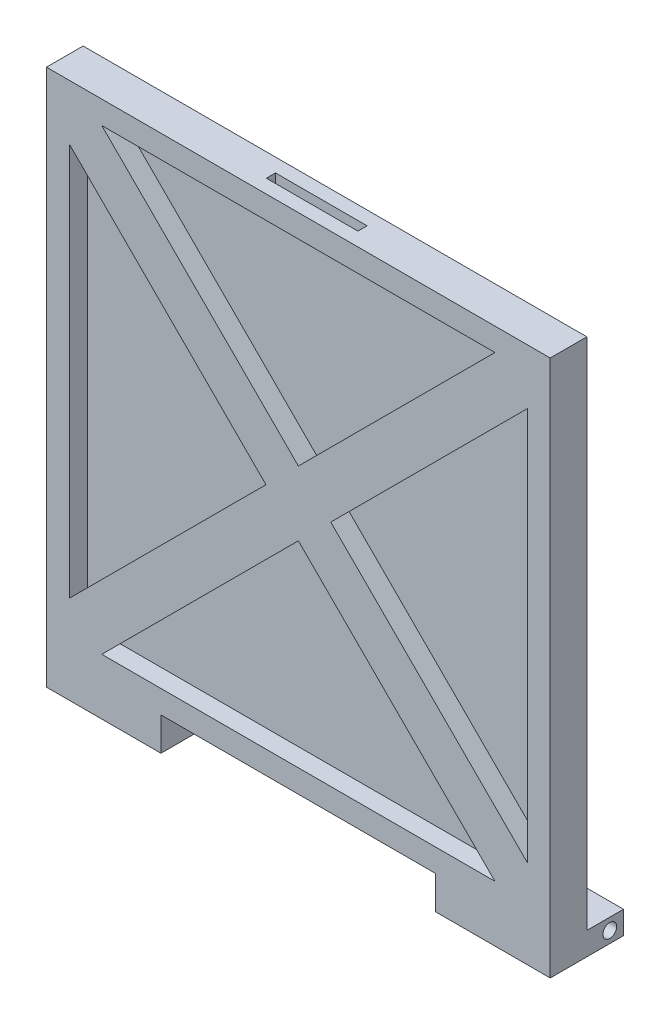
ISO-10303-21;
HEADER;
FILE_DESCRIPTION(('STEP AP214'),'2;1');
FILE_NAME('part.step','',(''),(''),'','','');
FILE_SCHEMA(('AUTOMOTIVE_DESIGN { 1 0 10303 214 1 1 1 1 }'));
ENDSEC;
DATA;
#1=APPLICATION_CONTEXT('core data for automotive mechanical design processes');
#2=APPLICATION_PROTOCOL_DEFINITION('international standard','automotive_design',2000,#1);
#3=PRODUCT_CONTEXT('',#1,'mechanical');
#4=PRODUCT('Part','Part','',(#3));
#5=PRODUCT_RELATED_PRODUCT_CATEGORY('part','',(#4));
#6=PRODUCT_DEFINITION_FORMATION('','',#4);
#7=PRODUCT_DEFINITION_CONTEXT('part definition',#1,'design');
#8=PRODUCT_DEFINITION('design','',#6,#7);
#9=PRODUCT_DEFINITION_SHAPE('','',#8);
#10=(LENGTH_UNIT() NAMED_UNIT(*) SI_UNIT(.MILLI.,.METRE.));
#11=(NAMED_UNIT(*) PLANE_ANGLE_UNIT() SI_UNIT($,.RADIAN.));
#12=(NAMED_UNIT(*) SI_UNIT($,.STERADIAN.) SOLID_ANGLE_UNIT());
#13=UNCERTAINTY_MEASURE_WITH_UNIT(LENGTH_MEASURE(1.E-05),#10,'distance_accuracy_value','');
#14=(GEOMETRIC_REPRESENTATION_CONTEXT(3) GLOBAL_UNCERTAINTY_ASSIGNED_CONTEXT((#13)) GLOBAL_UNIT_ASSIGNED_CONTEXT((#10,
#11,#12)) REPRESENTATION_CONTEXT('',''));
#15=CARTESIAN_POINT('',(0.,0.,0.));
#16=DIRECTION('',(0.,0.,1.));
#17=DIRECTION('',(1.,0.,0.));
#18=AXIS2_PLACEMENT_3D('',#15,#16,#17);
#19=CARTESIAN_POINT('',(55.,-55.,8.));
#20=DIRECTION('',(0.,1.,0.));
#21=DIRECTION('',(-1.,0.,0.));
#22=AXIS2_PLACEMENT_3D('',#19,#20,#21);
#23=PLANE('',#22);
#24=DIRECTION('',(0.,0.,1.));
#25=VECTOR('',#24,1.);
#26=CARTESIAN_POINT('',(-30.,-55.,0.));
#27=LINE('',#26,#25);
#28=CARTESIAN_POINT('',(-30.,-55.,0.));
#29=VERTEX_POINT('',#28);
#30=CARTESIAN_POINT('',(-30.,-55.,8.));
#31=VERTEX_POINT('',#30);
#32=EDGE_CURVE('E366',#29,#31,#27,.T.);
#33=ORIENTED_EDGE('',*,*,#32,.F.);
#34=DIRECTION('',(1.,0.,0.));
#35=VECTOR('',#34,1.);
#36=CARTESIAN_POINT('',(55.,-55.,0.));
#37=LINE('',#36,#35);
#38=CARTESIAN_POINT('',(30.,-55.,0.));
#39=VERTEX_POINT('',#38);
#40=EDGE_CURVE('E446',#29,#39,#37,.T.);
#41=ORIENTED_EDGE('',*,*,#40,.T.);
#42=DIRECTION('',(0.,0.,1.));
#43=VECTOR('',#42,1.);
#44=CARTESIAN_POINT('',(30.,-55.,0.));
#45=LINE('',#44,#43);
#46=CARTESIAN_POINT('',(30.,-55.,8.));
#47=VERTEX_POINT('',#46);
#48=EDGE_CURVE('E399',#39,#47,#45,.T.);
#49=ORIENTED_EDGE('',*,*,#48,.T.);
#50=DIRECTION('',(1.,0.,0.));
#51=VECTOR('',#50,1.);
#52=CARTESIAN_POINT('',(55.,-55.,8.));
#53=LINE('',#52,#51);
#54=EDGE_CURVE('E438',#31,#47,#53,.T.);
#55=ORIENTED_EDGE('',*,*,#54,.F.);
#56=EDGE_LOOP('',(#33,#41,#49,#55));
#57=FACE_BOUND('',#56,.T.);
#58=ADVANCED_FACE('F38',(#57),#23,.F.);
#59=CARTESIAN_POINT('',(-55.,-55.,8.));
#60=DIRECTION('',(1.,0.,0.));
#61=DIRECTION('',(0.,0.,-1.));
#62=AXIS2_PLACEMENT_3D('',#59,#60,#61);
#63=PLANE('',#62);
#64=CARTESIAN_POINT('',(-55.,-59.7629076678404,-5.));
#65=DIRECTION('',(1.,0.,0.));
#66=DIRECTION('',(0.,0.,-1.));
#67=AXIS2_PLACEMENT_3D('',#64,#65,#66);
#68=CIRCLE('',#67,1.5);
#69=CARTESIAN_POINT('',(-55.,-59.7629076678404,-6.5));
#70=VERTEX_POINT('',#69);
#71=EDGE_CURVE('E362',#70,#70,#68,.T.);
#72=ORIENTED_EDGE('',*,*,#71,.T.);
#73=EDGE_LOOP('',(#72));
#74=FACE_BOUND('',#73,.T.);
#75=DIRECTION('',(0.,-1.,0.));
#76=VECTOR('',#75,1.);
#77=CARTESIAN_POINT('',(-55.,-55.,0.));
#78=LINE('',#77,#76);
#79=CARTESIAN_POINT('',(-55.,55.,0.));
#80=VERTEX_POINT('',#79);
#81=CARTESIAN_POINT('',(-55.,-57.25,0.));
#82=VERTEX_POINT('',#81);
#83=EDGE_CURVE('E429',#80,#82,#78,.T.);
#84=ORIENTED_EDGE('',*,*,#83,.T.);
#85=DIRECTION('',(0.,0.,1.));
#86=VECTOR('',#85,1.);
#87=CARTESIAN_POINT('',(-55.,-57.25,-8.));
#88=LINE('',#87,#86);
#89=CARTESIAN_POINT('',(-55.,-57.25,-8.));
#90=VERTEX_POINT('',#89);
#91=EDGE_CURVE('E365',#90,#82,#88,.T.);
#92=ORIENTED_EDGE('',*,*,#91,.F.);
#93=DIRECTION('',(0.,1.,0.));
#94=VECTOR('',#93,1.);
#95=CARTESIAN_POINT('',(-55.,-62.25,-8.));
#96=LINE('',#95,#94);
#97=CARTESIAN_POINT('',(-55.,-62.25,-8.));
#98=VERTEX_POINT('',#97);
#99=EDGE_CURVE('E384',#98,#90,#96,.T.);
#100=ORIENTED_EDGE('',*,*,#99,.F.);
#101=DIRECTION('',(0.,0.,-1.));
#102=VECTOR('',#101,1.);
#103=CARTESIAN_POINT('',(-55.,-62.25,8.));
#104=LINE('',#103,#102);
#105=CARTESIAN_POINT('',(-55.,-62.25,8.));
#106=VERTEX_POINT('',#105);
#107=EDGE_CURVE('E370',#106,#98,#104,.T.);
#108=ORIENTED_EDGE('',*,*,#107,.F.);
#109=DIRECTION('',(0.,-1.,0.));
#110=VECTOR('',#109,1.);
#111=CARTESIAN_POINT('',(-55.,-55.,8.));
#112=LINE('',#111,#110);
#113=CARTESIAN_POINT('',(-55.,55.,8.));
#114=VERTEX_POINT('',#113);
#115=EDGE_CURVE('E436',#114,#106,#112,.T.);
#116=ORIENTED_EDGE('',*,*,#115,.F.);
#117=DIRECTION('',(0.,0.,-1.));
#118=VECTOR('',#117,1.);
#119=CARTESIAN_POINT('',(-55.,55.,8.));
#120=LINE('',#119,#118);
#121=EDGE_CURVE('E47',#114,#80,#120,.T.);
#122=ORIENTED_EDGE('',*,*,#121,.T.);
#123=EDGE_LOOP('',(#84,#92,#100,#108,#116,#122));
#124=FACE_BOUND('',#123,.T.);
#125=ADVANCED_FACE('F40',(#74,#124),#63,.F.);
#126=CARTESIAN_POINT('',(55.,-55.,8.));
#127=DIRECTION('',(-1.,0.,0.));
#128=DIRECTION('',(0.,0.,1.));
#129=AXIS2_PLACEMENT_3D('',#126,#127,#128);
#130=PLANE('',#129);
#131=CARTESIAN_POINT('',(55.,-59.7629076678404,-5.));
#132=DIRECTION('',(-1.,0.,0.));
#133=DIRECTION('',(0.,0.,1.));
#134=AXIS2_PLACEMENT_3D('',#131,#132,#133);
#135=CIRCLE('',#134,1.5);
#136=CARTESIAN_POINT('',(55.,-59.7629076678404,-3.5));
#137=VERTEX_POINT('',#136);
#138=EDGE_CURVE('E352',#137,#137,#135,.T.);
#139=ORIENTED_EDGE('',*,*,#138,.T.);
#140=EDGE_LOOP('',(#139));
#141=FACE_BOUND('',#140,.T.);
#142=DIRECTION('',(0.,1.,0.));
#143=VECTOR('',#142,1.);
#144=CARTESIAN_POINT('',(55.,-55.,0.));
#145=LINE('',#144,#143);
#146=CARTESIAN_POINT('',(55.,-57.25,0.));
#147=VERTEX_POINT('',#146);
#148=CARTESIAN_POINT('',(55.,55.,0.));
#149=VERTEX_POINT('',#148);
#150=EDGE_CURVE('E448',#147,#149,#145,.T.);
#151=ORIENTED_EDGE('',*,*,#150,.T.);
#152=DIRECTION('',(0.,0.,-1.));
#153=VECTOR('',#152,1.);
#154=CARTESIAN_POINT('',(55.,55.,8.));
#155=LINE('',#154,#153);
#156=CARTESIAN_POINT('',(55.,55.,8.));
#157=VERTEX_POINT('',#156);
#158=EDGE_CURVE('E11',#157,#149,#155,.T.);
#159=ORIENTED_EDGE('',*,*,#158,.F.);
#160=DIRECTION('',(0.,1.,0.));
#161=VECTOR('',#160,1.);
#162=CARTESIAN_POINT('',(55.,-55.,8.));
#163=LINE('',#162,#161);
#164=CARTESIAN_POINT('',(55.,-62.25,8.));
#165=VERTEX_POINT('',#164);
#166=EDGE_CURVE('E441',#165,#157,#163,.T.);
#167=ORIENTED_EDGE('',*,*,#166,.F.);
#168=DIRECTION('',(0.,0.,-1.));
#169=VECTOR('',#168,1.);
#170=CARTESIAN_POINT('',(55.,-62.25,8.));
#171=LINE('',#170,#169);
#172=CARTESIAN_POINT('',(55.,-62.25,-8.));
#173=VERTEX_POINT('',#172);
#174=EDGE_CURVE('E390',#165,#173,#171,.T.);
#175=ORIENTED_EDGE('',*,*,#174,.T.);
#176=DIRECTION('',(0.,1.,0.));
#177=VECTOR('',#176,1.);
#178=CARTESIAN_POINT('',(55.,-62.25,-8.));
#179=LINE('',#178,#177);
#180=CARTESIAN_POINT('',(55.,-57.25,-8.));
#181=VERTEX_POINT('',#180);
#182=EDGE_CURVE('E421',#173,#181,#179,.T.);
#183=ORIENTED_EDGE('',*,*,#182,.T.);
#184=DIRECTION('',(0.,0.,1.));
#185=VECTOR('',#184,1.);
#186=CARTESIAN_POINT('',(55.,-57.25,-8.));
#187=LINE('',#186,#185);
#188=EDGE_CURVE('E403',#181,#147,#187,.T.);
#189=ORIENTED_EDGE('',*,*,#188,.T.);
#190=EDGE_LOOP('',(#151,#159,#167,#175,#183,#189));
#191=FACE_BOUND('',#190,.T.);
#192=ADVANCED_FACE('F484',(#141,#191),#130,.F.);
#193=CARTESIAN_POINT('',(55.,55.,8.));
#194=DIRECTION('',(0.,-1.,0.));
#195=DIRECTION('',(1.,0.,0.));
#196=AXIS2_PLACEMENT_3D('',#193,#194,#195);
#197=PLANE('',#196);
#198=DIRECTION('',(1.,0.,0.));
#199=VECTOR('',#198,1.);
#200=CARTESIAN_POINT('',(-10.,55.,4.99999999999999));
#201=LINE('',#200,#199);
#202=CARTESIAN_POINT('',(-10.,55.,4.99999999999999));
#203=VERTEX_POINT('',#202);
#204=CARTESIAN_POINT('',(9.99999999999999,55.,4.99999999999999));
#205=VERTEX_POINT('',#204);
#206=EDGE_CURVE('E253',#203,#205,#201,.T.);
#207=ORIENTED_EDGE('',*,*,#206,.F.);
#208=DIRECTION('',(0.,0.,1.));
#209=VECTOR('',#208,1.);
#210=CARTESIAN_POINT('',(-10.,55.,2.99999999999999));
#211=LINE('',#210,#209);
#212=CARTESIAN_POINT('',(-10.,55.,2.99999999999999));
#213=VERTEX_POINT('',#212);
#214=EDGE_CURVE('E54',#213,#203,#211,.T.);
#215=ORIENTED_EDGE('',*,*,#214,.F.);
#216=DIRECTION('',(-1.,0.,0.));
#217=VECTOR('',#216,1.);
#218=CARTESIAN_POINT('',(-10.,55.,2.99999999999999));
#219=LINE('',#218,#217);
#220=CARTESIAN_POINT('',(9.99999999999999,55.,2.99999999999999));
#221=VERTEX_POINT('',#220);
#222=EDGE_CURVE('E244',#221,#213,#219,.T.);
#223=ORIENTED_EDGE('',*,*,#222,.F.);
#224=DIRECTION('',(0.,0.,-1.));
#225=VECTOR('',#224,1.);
#226=CARTESIAN_POINT('',(9.99999999999999,55.,2.99999999999999));
#227=LINE('',#226,#225);
#228=EDGE_CURVE('E247',#205,#221,#227,.T.);
#229=ORIENTED_EDGE('',*,*,#228,.F.);
#230=EDGE_LOOP('',(#207,#215,#223,#229));
#231=FACE_BOUND('',#230,.T.);
#232=DIRECTION('',(-1.,0.,0.));
#233=VECTOR('',#232,1.);
#234=CARTESIAN_POINT('',(55.,55.,0.));
#235=LINE('',#234,#233);
#236=EDGE_CURVE('E439',#149,#80,#235,.T.);
#237=ORIENTED_EDGE('',*,*,#236,.T.);
#238=ORIENTED_EDGE('',*,*,#121,.F.);
#239=DIRECTION('',(-1.,0.,0.));
#240=VECTOR('',#239,1.);
#241=CARTESIAN_POINT('',(55.,55.,8.));
#242=LINE('',#241,#240);
#243=EDGE_CURVE('E443',#157,#114,#242,.T.);
#244=ORIENTED_EDGE('',*,*,#243,.F.);
#245=ORIENTED_EDGE('',*,*,#158,.T.);
#246=EDGE_LOOP('',(#237,#238,#244,#245));
#247=FACE_BOUND('',#246,.T.);
#248=ADVANCED_FACE('F482',(#231,#247),#197,.F.);
#249=CARTESIAN_POINT('',(0.,0.,8.));
#250=DIRECTION('',(0.,0.,1.));
#251=DIRECTION('',(1.,0.,0.));
#252=AXIS2_PLACEMENT_3D('',#249,#250,#251);
#253=PLANE('',#252);
#254=DIRECTION('',(-0.707106781186543,0.707106781186552,0.));
#255=VECTOR('',#254,1.);
#256=CARTESIAN_POINT('',(42.9289321881342,-50.0000000000003,8.));
#257=LINE('',#256,#255);
#258=CARTESIAN_POINT('',(42.9289321881342,-50.0000000000003,8.));
#259=VERTEX_POINT('',#258);
#260=CARTESIAN_POINT('',(0.,-7.07106781186545,8.));
#261=VERTEX_POINT('',#260);
#262=EDGE_CURVE('E62',#259,#261,#257,.T.);
#263=ORIENTED_EDGE('',*,*,#262,.F.);
#264=DIRECTION('',(1.,0.,0.));
#265=VECTOR('',#264,1.);
#266=CARTESIAN_POINT('',(-42.9289321881349,-49.9999999999997,8.));
#267=LINE('',#266,#265);
#268=CARTESIAN_POINT('',(-42.9289321881349,-49.9999999999997,8.));
#269=VERTEX_POINT('',#268);
#270=EDGE_CURVE('E290',#269,#259,#267,.T.);
#271=ORIENTED_EDGE('',*,*,#270,.F.);
#272=DIRECTION('',(-0.707106781186552,-0.707106781186543,0.));
#273=VECTOR('',#272,1.);
#274=CARTESIAN_POINT('',(0.,-7.07106781186545,8.));
#275=LINE('',#274,#273);
#276=EDGE_CURVE('E298',#261,#269,#275,.T.);
#277=ORIENTED_EDGE('',*,*,#276,.F.);
#278=EDGE_LOOP('',(#263,#271,#277));
#279=FACE_BOUND('',#278,.T.);
#280=DIRECTION('',(-0.70710678118655,-0.707106781186545,0.));
#281=VECTOR('',#280,1.);
#282=CARTESIAN_POINT('',(50.0000000000001,42.9289321881344,8.));
#283=LINE('',#282,#281);
#284=CARTESIAN_POINT('',(50.0000000000001,42.9289321881344,8.));
#285=VERTEX_POINT('',#284);
#286=CARTESIAN_POINT('',(7.07106781186545,0.,8.));
#287=VERTEX_POINT('',#286);
#288=EDGE_CURVE('E305',#285,#287,#283,.T.);
#289=ORIENTED_EDGE('',*,*,#288,.F.);
#290=DIRECTION('',(0.,1.,0.));
#291=VECTOR('',#290,1.);
#292=CARTESIAN_POINT('',(49.9999999999998,-42.9289321881347,8.));
#293=LINE('',#292,#291);
#294=CARTESIAN_POINT('',(49.9999999999998,-42.9289321881347,8.));
#295=VERTEX_POINT('',#294);
#296=EDGE_CURVE('E313',#295,#285,#293,.T.);
#297=ORIENTED_EDGE('',*,*,#296,.F.);
#298=DIRECTION('',(0.707106781186545,-0.70710678118655,0.));
#299=VECTOR('',#298,1.);
#300=CARTESIAN_POINT('',(7.07106781186545,0.,8.));
#301=LINE('',#300,#299);
#302=EDGE_CURVE('E321',#287,#295,#301,.T.);
#303=ORIENTED_EDGE('',*,*,#302,.F.);
#304=EDGE_LOOP('',(#289,#297,#303));
#305=FACE_BOUND('',#304,.T.);
#306=DIRECTION('',(0.707106781186555,0.707106781186541,0.));
#307=VECTOR('',#306,1.);
#308=CARTESIAN_POINT('',(-50.0000000000004,-42.928932188134,8.));
#309=LINE('',#308,#307);
#310=CARTESIAN_POINT('',(-50.0000000000004,-42.928932188134,8.));
#311=VERTEX_POINT('',#310);
#312=CARTESIAN_POINT('',(-7.07106781186545,1.15359111152458E-13,8.));
#313=VERTEX_POINT('',#312);
#314=EDGE_CURVE('E259',#311,#313,#309,.T.);
#315=ORIENTED_EDGE('',*,*,#314,.F.);
#316=DIRECTION('',(0.,-1.,0.));
#317=VECTOR('',#316,1.);
#318=CARTESIAN_POINT('',(-49.9999999999995,42.9289321881351,8.));
#319=LINE('',#318,#317);
#320=CARTESIAN_POINT('',(-49.9999999999995,42.9289321881351,8.));
#321=VERTEX_POINT('',#320);
#322=EDGE_CURVE('E267',#321,#311,#319,.T.);
#323=ORIENTED_EDGE('',*,*,#322,.F.);
#324=DIRECTION('',(-0.70710678118654,0.707106781186555,0.));
#325=VECTOR('',#324,1.);
#326=CARTESIAN_POINT('',(-7.07106781186545,1.15698867355911E-13,8.));
#327=LINE('',#326,#325);
#328=EDGE_CURVE('E275',#313,#321,#327,.T.);
#329=ORIENTED_EDGE('',*,*,#328,.F.);
#330=EDGE_LOOP('',(#315,#323,#329));
#331=FACE_BOUND('',#330,.T.);
#332=DIRECTION('',(-1.,0.,0.));
#333=VECTOR('',#332,1.);
#334=CARTESIAN_POINT('',(42.9289321881346,50.,8.));
#335=LINE('',#334,#333);
#336=CARTESIAN_POINT('',(42.9289321881346,50.,8.));
#337=VERTEX_POINT('',#336);
#338=CARTESIAN_POINT('',(-42.9289321881345,50.,8.));
#339=VERTEX_POINT('',#338);
#340=EDGE_CURVE('E328',#337,#339,#335,.T.);
#341=ORIENTED_EDGE('',*,*,#340,.F.);
#342=DIRECTION('',(0.707106781186547,0.707106781186548,0.));
#343=VECTOR('',#342,1.);
#344=CARTESIAN_POINT('',(0.,7.07106781186545,8.));
#345=LINE('',#344,#343);
#346=CARTESIAN_POINT('',(0.,7.07106781186545,8.));
#347=VERTEX_POINT('',#346);
#348=EDGE_CURVE('E337',#347,#337,#345,.T.);
#349=ORIENTED_EDGE('',*,*,#348,.F.);
#350=DIRECTION('',(0.707106781186548,-0.707106781186547,0.));
#351=VECTOR('',#350,1.);
#352=CARTESIAN_POINT('',(-42.9289321881345,50.,8.));
#353=LINE('',#352,#351);
#354=EDGE_CURVE('E345',#339,#347,#353,.T.);
#355=ORIENTED_EDGE('',*,*,#354,.F.);
#356=EDGE_LOOP('',(#341,#349,#355));
#357=FACE_BOUND('',#356,.T.);
#358=ORIENTED_EDGE('',*,*,#115,.T.);
#359=DIRECTION('',(-1.,0.,0.));
#360=VECTOR('',#359,1.);
#361=CARTESIAN_POINT('',(-30.,-62.25,8.));
#362=LINE('',#361,#360);
#363=CARTESIAN_POINT('',(-30.,-62.25,8.));
#364=VERTEX_POINT('',#363);
#365=EDGE_CURVE('E387',#364,#106,#362,.T.);
#366=ORIENTED_EDGE('',*,*,#365,.F.);
#367=DIRECTION('',(0.,-1.,0.));
#368=VECTOR('',#367,1.);
#369=CARTESIAN_POINT('',(-30.,-55.,8.));
#370=LINE('',#369,#368);
#371=EDGE_CURVE('E379',#31,#364,#370,.T.);
#372=ORIENTED_EDGE('',*,*,#371,.F.);
#373=ORIENTED_EDGE('',*,*,#54,.T.);
#374=DIRECTION('',(0.,-1.,0.));
#375=VECTOR('',#374,1.);
#376=CARTESIAN_POINT('',(30.,-55.,8.));
#377=LINE('',#376,#375);
#378=CARTESIAN_POINT('',(30.,-62.25,8.));
#379=VERTEX_POINT('',#378);
#380=EDGE_CURVE('E402',#47,#379,#377,.T.);
#381=ORIENTED_EDGE('',*,*,#380,.T.);
#382=DIRECTION('',(1.,0.,0.));
#383=VECTOR('',#382,1.);
#384=CARTESIAN_POINT('',(30.,-62.25,8.));
#385=LINE('',#384,#383);
#386=EDGE_CURVE('E418',#379,#165,#385,.T.);
#387=ORIENTED_EDGE('',*,*,#386,.T.);
#388=ORIENTED_EDGE('',*,*,#166,.T.);
#389=ORIENTED_EDGE('',*,*,#243,.T.);
#390=EDGE_LOOP('',(#358,#366,#372,#373,#381,#387,#388,#389));
#391=FACE_BOUND('',#390,.T.);
#392=ADVANCED_FACE('F480',(#279,#305,#331,#357,#391),#253,.T.);
#393=CARTESIAN_POINT('',(0.,0.,0.));
#394=DIRECTION('',(0.,0.,1.));
#395=DIRECTION('',(1.,0.,0.));
#396=AXIS2_PLACEMENT_3D('',#393,#394,#395);
#397=PLANE('',#396);
#398=ORIENTED_EDGE('',*,*,#83,.F.);
#399=ORIENTED_EDGE('',*,*,#236,.F.);
#400=ORIENTED_EDGE('',*,*,#150,.F.);
#401=DIRECTION('',(1.,0.,0.));
#402=VECTOR('',#401,1.);
#403=CARTESIAN_POINT('',(30.,-57.25,0.));
#404=LINE('',#403,#402);
#405=CARTESIAN_POINT('',(30.,-57.25,0.));
#406=VERTEX_POINT('',#405);
#407=EDGE_CURVE('E426',#406,#147,#404,.T.);
#408=ORIENTED_EDGE('',*,*,#407,.F.);
#409=DIRECTION('',(0.,1.,0.));
#410=VECTOR('',#409,1.);
#411=CARTESIAN_POINT('',(30.,-57.25,0.));
#412=LINE('',#411,#410);
#413=EDGE_CURVE('E415',#406,#39,#412,.T.);
#414=ORIENTED_EDGE('',*,*,#413,.T.);
#415=ORIENTED_EDGE('',*,*,#40,.F.);
#416=DIRECTION('',(0.,1.,0.));
#417=VECTOR('',#416,1.);
#418=CARTESIAN_POINT('',(-30.,-57.25,0.));
#419=LINE('',#418,#417);
#420=CARTESIAN_POINT('',(-30.,-57.25,0.));
#421=VERTEX_POINT('',#420);
#422=EDGE_CURVE('E369',#421,#29,#419,.T.);
#423=ORIENTED_EDGE('',*,*,#422,.F.);
#424=DIRECTION('',(-1.,0.,0.));
#425=VECTOR('',#424,1.);
#426=CARTESIAN_POINT('',(-30.,-57.25,0.));
#427=LINE('',#426,#425);
#428=EDGE_CURVE('E381',#421,#82,#427,.T.);
#429=ORIENTED_EDGE('',*,*,#428,.T.);
#430=EDGE_LOOP('',(#398,#399,#400,#408,#414,#415,#423,#429));
#431=FACE_BOUND('',#430,.T.);
#432=ADVANCED_FACE('F462',(#431),#397,.F.);
#433=CARTESIAN_POINT('',(30.,-57.25,-8.));
#434=DIRECTION('',(0.,1.,0.));
#435=DIRECTION('',(0.,0.,1.));
#436=AXIS2_PLACEMENT_3D('',#433,#434,#435);
#437=PLANE('',#436);
#438=ORIENTED_EDGE('',*,*,#188,.F.);
#439=DIRECTION('',(1.,0.,0.));
#440=VECTOR('',#439,1.);
#441=CARTESIAN_POINT('',(30.,-57.25,-8.));
#442=LINE('',#441,#440);
#443=CARTESIAN_POINT('',(30.,-57.25,-8.));
#444=VERTEX_POINT('',#443);
#445=EDGE_CURVE('E430',#444,#181,#442,.T.);
#446=ORIENTED_EDGE('',*,*,#445,.F.);
#447=DIRECTION('',(0.,0.,1.));
#448=VECTOR('',#447,1.);
#449=CARTESIAN_POINT('',(30.,-57.25,-8.));
#450=LINE('',#449,#448);
#451=EDGE_CURVE('E412',#444,#406,#450,.T.);
#452=ORIENTED_EDGE('',*,*,#451,.T.);
#453=ORIENTED_EDGE('',*,*,#407,.T.);
#454=EDGE_LOOP('',(#438,#446,#452,#453));
#455=FACE_BOUND('',#454,.T.);
#456=ADVANCED_FACE('F487',(#455),#437,.T.);
#457=CARTESIAN_POINT('',(30.,-62.25,-8.));
#458=DIRECTION('',(0.,0.,-1.));
#459=DIRECTION('',(-1.,0.,0.));
#460=AXIS2_PLACEMENT_3D('',#457,#458,#459);
#461=PLANE('',#460);
#462=ORIENTED_EDGE('',*,*,#182,.F.);
#463=DIRECTION('',(1.,0.,0.));
#464=VECTOR('',#463,1.);
#465=CARTESIAN_POINT('',(30.,-62.25,-8.));
#466=LINE('',#465,#464);
#467=CARTESIAN_POINT('',(30.,-62.25,-8.));
#468=VERTEX_POINT('',#467);
#469=EDGE_CURVE('E432',#468,#173,#466,.T.);
#470=ORIENTED_EDGE('',*,*,#469,.F.);
#471=DIRECTION('',(0.,1.,0.));
#472=VECTOR('',#471,1.);
#473=CARTESIAN_POINT('',(30.,-62.25,-8.));
#474=LINE('',#473,#472);
#475=EDGE_CURVE('E409',#468,#444,#474,.T.);
#476=ORIENTED_EDGE('',*,*,#475,.T.);
#477=ORIENTED_EDGE('',*,*,#445,.T.);
#478=EDGE_LOOP('',(#462,#470,#476,#477));
#479=FACE_BOUND('',#478,.T.);
#480=ADVANCED_FACE('F533',(#479),#461,.T.);
#481=CARTESIAN_POINT('',(30.,-62.25,8.));
#482=DIRECTION('',(0.,-1.,0.));
#483=DIRECTION('',(0.,0.,-1.));
#484=AXIS2_PLACEMENT_3D('',#481,#482,#483);
#485=PLANE('',#484);
#486=ORIENTED_EDGE('',*,*,#174,.F.);
#487=ORIENTED_EDGE('',*,*,#386,.F.);
#488=DIRECTION('',(0.,0.,-1.));
#489=VECTOR('',#488,1.);
#490=CARTESIAN_POINT('',(30.,-62.25,8.));
#491=LINE('',#490,#489);
#492=EDGE_CURVE('E406',#379,#468,#491,.T.);
#493=ORIENTED_EDGE('',*,*,#492,.T.);
#494=ORIENTED_EDGE('',*,*,#469,.T.);
#495=EDGE_LOOP('',(#486,#487,#493,#494));
#496=FACE_BOUND('',#495,.T.);
#497=ADVANCED_FACE('F530',(#496),#485,.T.);
#498=CARTESIAN_POINT('',(30.,0.,0.));
#499=DIRECTION('',(1.,0.,0.));
#500=DIRECTION('',(0.,0.,-1.));
#501=AXIS2_PLACEMENT_3D('',#498,#499,#500);
#502=PLANE('',#501);
#503=CARTESIAN_POINT('',(30.,-59.7629076678404,-5.));
#504=DIRECTION('',(1.,0.,0.));
#505=DIRECTION('',(0.,0.,-1.));
#506=AXIS2_PLACEMENT_3D('',#503,#504,#505);
#507=CIRCLE('',#506,1.5);
#508=CARTESIAN_POINT('',(30.,-59.7629076678404,-6.5));
#509=VERTEX_POINT('',#508);
#510=EDGE_CURVE('E359',#509,#509,#507,.T.);
#511=ORIENTED_EDGE('',*,*,#510,.T.);
#512=EDGE_LOOP('',(#511));
#513=FACE_BOUND('',#512,.T.);
#514=ORIENTED_EDGE('',*,*,#48,.F.);
#515=ORIENTED_EDGE('',*,*,#413,.F.);
#516=ORIENTED_EDGE('',*,*,#451,.F.);
#517=ORIENTED_EDGE('',*,*,#475,.F.);
#518=ORIENTED_EDGE('',*,*,#492,.F.);
#519=ORIENTED_EDGE('',*,*,#380,.F.);
#520=EDGE_LOOP('',(#514,#515,#516,#517,#518,#519));
#521=FACE_BOUND('',#520,.T.);
#522=ADVANCED_FACE('F493',(#513,#521),#502,.F.);
#523=CARTESIAN_POINT('',(-30.,-62.25,8.));
#524=DIRECTION('',(0.,1.,0.));
#525=DIRECTION('',(0.,0.,1.));
#526=AXIS2_PLACEMENT_3D('',#523,#524,#525);
#527=PLANE('',#526);
#528=ORIENTED_EDGE('',*,*,#107,.T.);
#529=DIRECTION('',(-1.,0.,0.));
#530=VECTOR('',#529,1.);
#531=CARTESIAN_POINT('',(-30.,-62.25,-8.));
#532=LINE('',#531,#530);
#533=CARTESIAN_POINT('',(-30.,-62.25,-8.));
#534=VERTEX_POINT('',#533);
#535=EDGE_CURVE('E391',#534,#98,#532,.T.);
#536=ORIENTED_EDGE('',*,*,#535,.F.);
#537=DIRECTION('',(0.,0.,-1.));
#538=VECTOR('',#537,1.);
#539=CARTESIAN_POINT('',(-30.,-62.25,8.));
#540=LINE('',#539,#538);
#541=EDGE_CURVE('E377',#364,#534,#540,.T.);
#542=ORIENTED_EDGE('',*,*,#541,.F.);
#543=ORIENTED_EDGE('',*,*,#365,.T.);
#544=EDGE_LOOP('',(#528,#536,#542,#543));
#545=FACE_BOUND('',#544,.T.);
#546=ADVANCED_FACE('F476',(#545),#527,.F.);
#547=CARTESIAN_POINT('',(-30.,-62.25,-8.));
#548=DIRECTION('',(0.,0.,1.));
#549=DIRECTION('',(1.,0.,0.));
#550=AXIS2_PLACEMENT_3D('',#547,#548,#549);
#551=PLANE('',#550);
#552=ORIENTED_EDGE('',*,*,#99,.T.);
#553=DIRECTION('',(-1.,0.,0.));
#554=VECTOR('',#553,1.);
#555=CARTESIAN_POINT('',(-30.,-57.25,-8.));
#556=LINE('',#555,#554);
#557=CARTESIAN_POINT('',(-30.,-57.25,-8.));
#558=VERTEX_POINT('',#557);
#559=EDGE_CURVE('E394',#558,#90,#556,.T.);
#560=ORIENTED_EDGE('',*,*,#559,.F.);
#561=DIRECTION('',(0.,1.,0.));
#562=VECTOR('',#561,1.);
#563=CARTESIAN_POINT('',(-30.,-62.25,-8.));
#564=LINE('',#563,#562);
#565=EDGE_CURVE('E375',#534,#558,#564,.T.);
#566=ORIENTED_EDGE('',*,*,#565,.F.);
#567=ORIENTED_EDGE('',*,*,#535,.T.);
#568=EDGE_LOOP('',(#552,#560,#566,#567));
#569=FACE_BOUND('',#568,.T.);
#570=ADVANCED_FACE('F471',(#569),#551,.F.);
#571=CARTESIAN_POINT('',(-30.,-57.25,-8.));
#572=DIRECTION('',(0.,-1.,0.));
#573=DIRECTION('',(0.,0.,-1.));
#574=AXIS2_PLACEMENT_3D('',#571,#572,#573);
#575=PLANE('',#574);
#576=ORIENTED_EDGE('',*,*,#91,.T.);
#577=ORIENTED_EDGE('',*,*,#428,.F.);
#578=DIRECTION('',(0.,0.,1.));
#579=VECTOR('',#578,1.);
#580=CARTESIAN_POINT('',(-30.,-57.25,-8.));
#581=LINE('',#580,#579);
#582=EDGE_CURVE('E373',#558,#421,#581,.T.);
#583=ORIENTED_EDGE('',*,*,#582,.F.);
#584=ORIENTED_EDGE('',*,*,#559,.T.);
#585=EDGE_LOOP('',(#576,#577,#583,#584));
#586=FACE_BOUND('',#585,.T.);
#587=ADVANCED_FACE('F467',(#586),#575,.F.);
#588=CARTESIAN_POINT('',(-30.,0.,0.));
#589=DIRECTION('',(-1.,0.,0.));
#590=DIRECTION('',(0.,0.,-1.));
#591=AXIS2_PLACEMENT_3D('',#588,#589,#590);
#592=PLANE('',#591);
#593=CARTESIAN_POINT('',(-30.,-59.7629076678404,-5.));
#594=DIRECTION('',(-1.,0.,0.));
#595=DIRECTION('',(0.,0.,1.));
#596=AXIS2_PLACEMENT_3D('',#593,#594,#595);
#597=CIRCLE('',#596,1.5);
#598=CARTESIAN_POINT('',(-30.,-59.7629076678404,-3.5));
#599=VERTEX_POINT('',#598);
#600=EDGE_CURVE('E42',#599,#599,#597,.T.);
#601=ORIENTED_EDGE('',*,*,#600,.T.);
#602=EDGE_LOOP('',(#601));
#603=FACE_BOUND('',#602,.T.);
#604=ORIENTED_EDGE('',*,*,#32,.T.);
#605=ORIENTED_EDGE('',*,*,#371,.T.);
#606=ORIENTED_EDGE('',*,*,#541,.T.);
#607=ORIENTED_EDGE('',*,*,#565,.T.);
#608=ORIENTED_EDGE('',*,*,#582,.T.);
#609=ORIENTED_EDGE('',*,*,#422,.T.);
#610=EDGE_LOOP('',(#604,#605,#606,#607,#608,#609));
#611=FACE_BOUND('',#610,.T.);
#612=ADVANCED_FACE('F498',(#603,#611),#592,.F.);
#613=CARTESIAN_POINT('',(55.,-59.7629076678404,-5.));
#614=DIRECTION('',(-1.,0.,0.));
#615=DIRECTION('',(0.,0.,1.));
#616=AXIS2_PLACEMENT_3D('',#613,#614,#615);
#617=CYLINDRICAL_SURFACE('',#616,1.5);
#618=ORIENTED_EDGE('',*,*,#600,.F.);
#619=EDGE_LOOP('',(#618));
#620=FACE_BOUND('',#619,.T.);
#621=ORIENTED_EDGE('',*,*,#71,.F.);
#622=EDGE_LOOP('',(#621));
#623=FACE_BOUND('',#622,.T.);
#624=ADVANCED_FACE('F500',(#620,#623),#617,.F.);
#625=ORIENTED_EDGE('',*,*,#138,.F.);
#626=EDGE_LOOP('',(#625));
#627=FACE_BOUND('',#626,.T.);
#628=ORIENTED_EDGE('',*,*,#510,.F.);
#629=EDGE_LOOP('',(#628));
#630=FACE_BOUND('',#629,.T.);
#631=ADVANCED_FACE('F507',(#627,#630),#617,.F.);
#632=CARTESIAN_POINT('',(42.9289321881346,50.,4.));
#633=DIRECTION('',(0.,1.,0.));
#634=DIRECTION('',(-1.,0.,0.));
#635=AXIS2_PLACEMENT_3D('',#632,#633,#634);
#636=PLANE('',#635);
#637=ORIENTED_EDGE('',*,*,#340,.T.);
#638=DIRECTION('',(0.,0.,1.));
#639=VECTOR('',#638,1.);
#640=CARTESIAN_POINT('',(-42.9289321881345,50.,4.));
#641=LINE('',#640,#639);
#642=CARTESIAN_POINT('',(-42.9289321881345,50.,4.));
#643=VERTEX_POINT('',#642);
#644=EDGE_CURVE('E343',#643,#339,#641,.T.);
#645=ORIENTED_EDGE('',*,*,#644,.F.);
#646=DIRECTION('',(-1.,0.,0.));
#647=VECTOR('',#646,1.);
#648=CARTESIAN_POINT('',(42.9289321881346,50.,4.));
#649=LINE('',#648,#647);
#650=CARTESIAN_POINT('',(42.9289321881346,50.,4.));
#651=VERTEX_POINT('',#650);
#652=EDGE_CURVE('E333',#651,#643,#649,.T.);
#653=ORIENTED_EDGE('',*,*,#652,.F.);
#654=DIRECTION('',(0.,0.,1.));
#655=VECTOR('',#654,1.);
#656=CARTESIAN_POINT('',(42.9289321881346,50.,4.));
#657=LINE('',#656,#655);
#658=EDGE_CURVE('E350',#651,#337,#657,.T.);
#659=ORIENTED_EDGE('',*,*,#658,.T.);
#660=EDGE_LOOP('',(#637,#645,#653,#659));
#661=FACE_BOUND('',#660,.T.);
#662=ADVANCED_FACE('F600',(#661),#636,.F.);
#663=CARTESIAN_POINT('',(0.,7.07106781186545,4.));
#664=DIRECTION('',(0.707106781186548,-0.707106781186547,0.));
#665=DIRECTION('',(0.707106781186547,0.707106781186548,0.));
#666=AXIS2_PLACEMENT_3D('',#663,#664,#665);
#667=PLANE('',#666);
#668=ORIENTED_EDGE('',*,*,#348,.T.);
#669=ORIENTED_EDGE('',*,*,#658,.F.);
#670=DIRECTION('',(0.707106781186547,0.707106781186548,0.));
#671=VECTOR('',#670,1.);
#672=CARTESIAN_POINT('',(0.,7.07106781186545,4.));
#673=LINE('',#672,#671);
#674=CARTESIAN_POINT('',(0.,7.07106781186545,4.));
#675=VERTEX_POINT('',#674);
#676=EDGE_CURVE('E340',#675,#651,#673,.T.);
#677=ORIENTED_EDGE('',*,*,#676,.F.);
#678=DIRECTION('',(0.,0.,1.));
#679=VECTOR('',#678,1.);
#680=CARTESIAN_POINT('',(0.,7.07106781186545,4.));
#681=LINE('',#680,#679);
#682=EDGE_CURVE('E353',#675,#347,#681,.T.);
#683=ORIENTED_EDGE('',*,*,#682,.T.);
#684=EDGE_LOOP('',(#668,#669,#677,#683));
#685=FACE_BOUND('',#684,.T.);
#686=ADVANCED_FACE('F615',(#685),#667,.F.);
#687=CARTESIAN_POINT('',(-42.9289321881345,50.,4.));
#688=DIRECTION('',(-0.707106781186547,-0.707106781186548,0.));
#689=DIRECTION('',(0.707106781186548,-0.707106781186547,0.));
#690=AXIS2_PLACEMENT_3D('',#687,#688,#689);
#691=PLANE('',#690);
#692=ORIENTED_EDGE('',*,*,#354,.T.);
#693=ORIENTED_EDGE('',*,*,#682,.F.);
#694=DIRECTION('',(0.707106781186548,-0.707106781186547,0.));
#695=VECTOR('',#694,1.);
#696=CARTESIAN_POINT('',(-42.9289321881345,50.,4.));
#697=LINE('',#696,#695);
#698=EDGE_CURVE('E336',#643,#675,#697,.T.);
#699=ORIENTED_EDGE('',*,*,#698,.F.);
#700=ORIENTED_EDGE('',*,*,#644,.T.);
#701=EDGE_LOOP('',(#692,#693,#699,#700));
#702=FACE_BOUND('',#701,.T.);
#703=ADVANCED_FACE('F625',(#702),#691,.F.);
#704=CARTESIAN_POINT('',(0.,0.,4.));
#705=DIRECTION('',(0.,0.,1.));
#706=DIRECTION('',(1.,0.,0.));
#707=AXIS2_PLACEMENT_3D('',#704,#705,#706);
#708=PLANE('',#707);
#709=ORIENTED_EDGE('',*,*,#652,.T.);
#710=ORIENTED_EDGE('',*,*,#698,.T.);
#711=ORIENTED_EDGE('',*,*,#676,.T.);
#712=EDGE_LOOP('',(#709,#710,#711));
#713=FACE_BOUND('',#712,.T.);
#714=ADVANCED_FACE('F635',(#713),#708,.T.);
#715=CARTESIAN_POINT('',(-50.0000000000004,-42.928932188134,4.));
#716=DIRECTION('',(0.707106781186541,-0.707106781186555,0.));
#717=DIRECTION('',(0.707106781186555,0.707106781186541,0.));
#718=AXIS2_PLACEMENT_3D('',#715,#716,#717);
#719=PLANE('',#718);
#720=ORIENTED_EDGE('',*,*,#314,.T.);
#721=DIRECTION('',(0.,0.,1.));
#722=VECTOR('',#721,1.);
#723=CARTESIAN_POINT('',(-7.07106781186545,1.15698867355911E-13,4.));
#724=LINE('',#723,#722);
#725=CARTESIAN_POINT('',(-7.07106781186545,1.15698867355911E-13,4.));
#726=VERTEX_POINT('',#725);
#727=EDGE_CURVE('E273',#726,#313,#724,.T.);
#728=ORIENTED_EDGE('',*,*,#727,.F.);
#729=DIRECTION('',(0.707106781186555,0.707106781186541,0.));
#730=VECTOR('',#729,1.);
#731=CARTESIAN_POINT('',(-50.0000000000004,-42.928932188134,4.));
#732=LINE('',#731,#730);
#733=CARTESIAN_POINT('',(-50.0000000000004,-42.928932188134,4.));
#734=VERTEX_POINT('',#733);
#735=EDGE_CURVE('E263',#734,#726,#732,.T.);
#736=ORIENTED_EDGE('',*,*,#735,.F.);
#737=DIRECTION('',(0.,0.,1.));
#738=VECTOR('',#737,1.);
#739=CARTESIAN_POINT('',(-50.0000000000004,-42.928932188134,4.));
#740=LINE('',#739,#738);
#741=EDGE_CURVE('E280',#734,#311,#740,.T.);
#742=ORIENTED_EDGE('',*,*,#741,.T.);
#743=EDGE_LOOP('',(#720,#728,#736,#742));
#744=FACE_BOUND('',#743,.T.);
#745=ADVANCED_FACE('F645',(#744),#719,.F.);
#746=CARTESIAN_POINT('',(-49.9999999999995,42.9289321881351,4.));
#747=DIRECTION('',(-1.,0.,0.));
#748=DIRECTION('',(0.,-1.,0.));
#749=AXIS2_PLACEMENT_3D('',#746,#747,#748);
#750=PLANE('',#749);
#751=ORIENTED_EDGE('',*,*,#322,.T.);
#752=ORIENTED_EDGE('',*,*,#741,.F.);
#753=DIRECTION('',(0.,-1.,0.));
#754=VECTOR('',#753,1.);
#755=CARTESIAN_POINT('',(-49.9999999999995,42.9289321881351,4.));
#756=LINE('',#755,#754);
#757=CARTESIAN_POINT('',(-49.9999999999995,42.9289321881351,4.));
#758=VERTEX_POINT('',#757);
#759=EDGE_CURVE('E270',#758,#734,#756,.T.);
#760=ORIENTED_EDGE('',*,*,#759,.F.);
#761=DIRECTION('',(0.,0.,1.));
#762=VECTOR('',#761,1.);
#763=CARTESIAN_POINT('',(-49.9999999999995,42.9289321881351,4.));
#764=LINE('',#763,#762);
#765=EDGE_CURVE('E282',#758,#321,#764,.T.);
#766=ORIENTED_EDGE('',*,*,#765,.T.);
#767=EDGE_LOOP('',(#751,#752,#760,#766));
#768=FACE_BOUND('',#767,.T.);
#769=ADVANCED_FACE('F655',(#768),#750,.F.);
#770=CARTESIAN_POINT('',(-7.07106781186545,1.15698867355911E-13,4.));
#771=DIRECTION('',(0.707106781186555,0.70710678118654,0.));
#772=DIRECTION('',(-0.70710678118654,0.707106781186555,0.));
#773=AXIS2_PLACEMENT_3D('',#770,#771,#772);
#774=PLANE('',#773);
#775=ORIENTED_EDGE('',*,*,#328,.T.);
#776=ORIENTED_EDGE('',*,*,#765,.F.);
#777=DIRECTION('',(-0.70710678118654,0.707106781186555,0.));
#778=VECTOR('',#777,1.);
#779=CARTESIAN_POINT('',(-7.07106781186545,1.15698867355911E-13,4.));
#780=LINE('',#779,#778);
#781=EDGE_CURVE('E266',#726,#758,#780,.T.);
#782=ORIENTED_EDGE('',*,*,#781,.F.);
#783=ORIENTED_EDGE('',*,*,#727,.T.);
#784=EDGE_LOOP('',(#775,#776,#782,#783));
#785=FACE_BOUND('',#784,.T.);
#786=ADVANCED_FACE('F665',(#785),#774,.F.);
#787=CARTESIAN_POINT('',(0.,0.,4.));
#788=DIRECTION('',(0.,0.,1.));
#789=DIRECTION('',(1.,0.,0.));
#790=AXIS2_PLACEMENT_3D('',#787,#788,#789);
#791=PLANE('',#790);
#792=ORIENTED_EDGE('',*,*,#735,.T.);
#793=ORIENTED_EDGE('',*,*,#781,.T.);
#794=ORIENTED_EDGE('',*,*,#759,.T.);
#795=EDGE_LOOP('',(#792,#793,#794));
#796=FACE_BOUND('',#795,.T.);
#797=ADVANCED_FACE('F675',(#796),#791,.T.);
#798=CARTESIAN_POINT('',(50.0000000000001,42.9289321881344,4.));
#799=DIRECTION('',(-0.707106781186545,0.70710678118655,0.));
#800=DIRECTION('',(-0.70710678118655,-0.707106781186545,0.));
#801=AXIS2_PLACEMENT_3D('',#798,#799,#800);
#802=PLANE('',#801);
#803=ORIENTED_EDGE('',*,*,#288,.T.);
#804=DIRECTION('',(0.,0.,1.));
#805=VECTOR('',#804,1.);
#806=CARTESIAN_POINT('',(7.07106781186545,0.,4.));
#807=LINE('',#806,#805);
#808=CARTESIAN_POINT('',(7.07106781186545,0.,4.));
#809=VERTEX_POINT('',#808);
#810=EDGE_CURVE('E319',#809,#287,#807,.T.);
#811=ORIENTED_EDGE('',*,*,#810,.F.);
#812=DIRECTION('',(-0.70710678118655,-0.707106781186545,0.));
#813=VECTOR('',#812,1.);
#814=CARTESIAN_POINT('',(50.0000000000001,42.9289321881344,4.));
#815=LINE('',#814,#813);
#816=CARTESIAN_POINT('',(50.0000000000001,42.9289321881344,4.));
#817=VERTEX_POINT('',#816);
#818=EDGE_CURVE('E309',#817,#809,#815,.T.);
#819=ORIENTED_EDGE('',*,*,#818,.F.);
#820=DIRECTION('',(0.,0.,1.));
#821=VECTOR('',#820,1.);
#822=CARTESIAN_POINT('',(50.0000000000001,42.9289321881344,4.));
#823=LINE('',#822,#821);
#824=EDGE_CURVE('E326',#817,#285,#823,.T.);
#825=ORIENTED_EDGE('',*,*,#824,.T.);
#826=EDGE_LOOP('',(#803,#811,#819,#825));
#827=FACE_BOUND('',#826,.T.);
#828=ADVANCED_FACE('F685',(#827),#802,.F.);
#829=CARTESIAN_POINT('',(49.9999999999998,-42.9289321881347,4.));
#830=DIRECTION('',(1.,0.,0.));
#831=DIRECTION('',(0.,1.,0.));
#832=AXIS2_PLACEMENT_3D('',#829,#830,#831);
#833=PLANE('',#832);
#834=ORIENTED_EDGE('',*,*,#296,.T.);
#835=ORIENTED_EDGE('',*,*,#824,.F.);
#836=DIRECTION('',(0.,1.,0.));
#837=VECTOR('',#836,1.);
#838=CARTESIAN_POINT('',(49.9999999999998,-42.9289321881347,4.));
#839=LINE('',#838,#837);
#840=CARTESIAN_POINT('',(49.9999999999998,-42.9289321881347,4.));
#841=VERTEX_POINT('',#840);
#842=EDGE_CURVE('E316',#841,#817,#839,.T.);
#843=ORIENTED_EDGE('',*,*,#842,.F.);
#844=DIRECTION('',(0.,0.,1.));
#845=VECTOR('',#844,1.);
#846=CARTESIAN_POINT('',(49.9999999999998,-42.9289321881347,4.));
#847=LINE('',#846,#845);
#848=EDGE_CURVE('E329',#841,#295,#847,.T.);
#849=ORIENTED_EDGE('',*,*,#848,.T.);
#850=EDGE_LOOP('',(#834,#835,#843,#849));
#851=FACE_BOUND('',#850,.T.);
#852=ADVANCED_FACE('F695',(#851),#833,.F.);
#853=CARTESIAN_POINT('',(7.07106781186545,0.,4.));
#854=DIRECTION('',(-0.70710678118655,-0.707106781186545,0.));
#855=DIRECTION('',(0.707106781186545,-0.70710678118655,0.));
#856=AXIS2_PLACEMENT_3D('',#853,#854,#855);
#857=PLANE('',#856);
#858=ORIENTED_EDGE('',*,*,#302,.T.);
#859=ORIENTED_EDGE('',*,*,#848,.F.);
#860=DIRECTION('',(0.707106781186545,-0.70710678118655,0.));
#861=VECTOR('',#860,1.);
#862=CARTESIAN_POINT('',(7.07106781186545,0.,4.));
#863=LINE('',#862,#861);
#864=EDGE_CURVE('E312',#809,#841,#863,.T.);
#865=ORIENTED_EDGE('',*,*,#864,.F.);
#866=ORIENTED_EDGE('',*,*,#810,.T.);
#867=EDGE_LOOP('',(#858,#859,#865,#866));
#868=FACE_BOUND('',#867,.T.);
#869=ADVANCED_FACE('F705',(#868),#857,.F.);
#870=CARTESIAN_POINT('',(0.,0.,4.));
#871=DIRECTION('',(0.,0.,1.));
#872=DIRECTION('',(1.,0.,0.));
#873=AXIS2_PLACEMENT_3D('',#870,#871,#872);
#874=PLANE('',#873);
#875=ORIENTED_EDGE('',*,*,#818,.T.);
#876=ORIENTED_EDGE('',*,*,#864,.T.);
#877=ORIENTED_EDGE('',*,*,#842,.T.);
#878=EDGE_LOOP('',(#875,#876,#877));
#879=FACE_BOUND('',#878,.T.);
#880=ADVANCED_FACE('F715',(#879),#874,.T.);
#881=CARTESIAN_POINT('',(42.9289321881342,-50.0000000000003,4.));
#882=DIRECTION('',(0.707106781186552,0.707106781186543,0.));
#883=DIRECTION('',(-0.707106781186543,0.707106781186552,0.));
#884=AXIS2_PLACEMENT_3D('',#881,#882,#883);
#885=PLANE('',#884);
#886=ORIENTED_EDGE('',*,*,#262,.T.);
#887=DIRECTION('',(0.,0.,1.));
#888=VECTOR('',#887,1.);
#889=CARTESIAN_POINT('',(0.,-7.07106781186545,4.));
#890=LINE('',#889,#888);
#891=CARTESIAN_POINT('',(0.,-7.07106781186545,4.));
#892=VERTEX_POINT('',#891);
#893=EDGE_CURVE('E296',#892,#261,#890,.T.);
#894=ORIENTED_EDGE('',*,*,#893,.F.);
#895=DIRECTION('',(-0.707106781186543,0.707106781186552,0.));
#896=VECTOR('',#895,1.);
#897=CARTESIAN_POINT('',(42.9289321881342,-50.0000000000003,4.));
#898=LINE('',#897,#896);
#899=CARTESIAN_POINT('',(42.9289321881342,-50.0000000000003,4.));
#900=VERTEX_POINT('',#899);
#901=EDGE_CURVE('E286',#900,#892,#898,.T.);
#902=ORIENTED_EDGE('',*,*,#901,.F.);
#903=DIRECTION('',(0.,0.,1.));
#904=VECTOR('',#903,1.);
#905=CARTESIAN_POINT('',(42.9289321881342,-50.0000000000003,4.));
#906=LINE('',#905,#904);
#907=EDGE_CURVE('E303',#900,#259,#906,.T.);
#908=ORIENTED_EDGE('',*,*,#907,.T.);
#909=EDGE_LOOP('',(#886,#894,#902,#908));
#910=FACE_BOUND('',#909,.T.);
#911=ADVANCED_FACE('F725',(#910),#885,.F.);
#912=CARTESIAN_POINT('',(-42.9289321881349,-49.9999999999997,4.));
#913=DIRECTION('',(0.,-1.,0.));
#914=DIRECTION('',(1.,0.,0.));
#915=AXIS2_PLACEMENT_3D('',#912,#913,#914);
#916=PLANE('',#915);
#917=ORIENTED_EDGE('',*,*,#270,.T.);
#918=ORIENTED_EDGE('',*,*,#907,.F.);
#919=DIRECTION('',(1.,0.,0.));
#920=VECTOR('',#919,1.);
#921=CARTESIAN_POINT('',(-42.9289321881349,-49.9999999999997,4.));
#922=LINE('',#921,#920);
#923=CARTESIAN_POINT('',(-42.9289321881349,-49.9999999999997,4.));
#924=VERTEX_POINT('',#923);
#925=EDGE_CURVE('E293',#924,#900,#922,.T.);
#926=ORIENTED_EDGE('',*,*,#925,.F.);
#927=DIRECTION('',(0.,0.,1.));
#928=VECTOR('',#927,1.);
#929=CARTESIAN_POINT('',(-42.9289321881349,-49.9999999999997,4.));
#930=LINE('',#929,#928);
#931=EDGE_CURVE('E306',#924,#269,#930,.T.);
#932=ORIENTED_EDGE('',*,*,#931,.T.);
#933=EDGE_LOOP('',(#917,#918,#926,#932));
#934=FACE_BOUND('',#933,.T.);
#935=ADVANCED_FACE('F735',(#934),#916,.F.);
#936=CARTESIAN_POINT('',(0.,-7.07106781186545,4.));
#937=DIRECTION('',(-0.707106781186543,0.707106781186552,0.));
#938=DIRECTION('',(-0.707106781186552,-0.707106781186543,0.));
#939=AXIS2_PLACEMENT_3D('',#936,#937,#938);
#940=PLANE('',#939);
#941=ORIENTED_EDGE('',*,*,#276,.T.);
#942=ORIENTED_EDGE('',*,*,#931,.F.);
#943=DIRECTION('',(-0.707106781186552,-0.707106781186543,0.));
#944=VECTOR('',#943,1.);
#945=CARTESIAN_POINT('',(0.,-7.07106781186545,4.));
#946=LINE('',#945,#944);
#947=EDGE_CURVE('E289',#892,#924,#946,.T.);
#948=ORIENTED_EDGE('',*,*,#947,.F.);
#949=ORIENTED_EDGE('',*,*,#893,.T.);
#950=EDGE_LOOP('',(#941,#942,#948,#949));
#951=FACE_BOUND('',#950,.T.);
#952=ADVANCED_FACE('F744',(#951),#940,.F.);
#953=CARTESIAN_POINT('',(0.,0.,4.));
#954=DIRECTION('',(0.,0.,1.));
#955=DIRECTION('',(1.,0.,0.));
#956=AXIS2_PLACEMENT_3D('',#953,#954,#955);
#957=PLANE('',#956);
#958=ORIENTED_EDGE('',*,*,#901,.T.);
#959=ORIENTED_EDGE('',*,*,#947,.T.);
#960=ORIENTED_EDGE('',*,*,#925,.T.);
#961=EDGE_LOOP('',(#958,#959,#960));
#962=FACE_BOUND('',#961,.T.);
#963=ADVANCED_FACE('F754',(#962),#957,.T.);
#964=CARTESIAN_POINT('',(-10.,53.,2.99999999999999));
#965=DIRECTION('',(-1.,0.,0.));
#966=DIRECTION('',(0.,-1.,0.));
#967=AXIS2_PLACEMENT_3D('',#964,#965,#966);
#968=PLANE('',#967);
#969=ORIENTED_EDGE('',*,*,#214,.T.);
#970=DIRECTION('',(0.,1.,0.));
#971=VECTOR('',#970,1.);
#972=CARTESIAN_POINT('',(-10.,53.,4.99999999999999));
#973=LINE('',#972,#971);
#974=CARTESIAN_POINT('',(-10.,53.,4.99999999999999));
#975=VERTEX_POINT('',#974);
#976=EDGE_CURVE('E222',#975,#203,#973,.T.);
#977=ORIENTED_EDGE('',*,*,#976,.F.);
#978=DIRECTION('',(0.,0.,1.));
#979=VECTOR('',#978,1.);
#980=CARTESIAN_POINT('',(-10.,53.,2.99999999999999));
#981=LINE('',#980,#979);
#982=CARTESIAN_POINT('',(-10.,53.,2.99999999999999));
#983=VERTEX_POINT('',#982);
#984=EDGE_CURVE('E226',#983,#975,#981,.T.);
#985=ORIENTED_EDGE('',*,*,#984,.F.);
#986=DIRECTION('',(0.,1.,0.));
#987=VECTOR('',#986,1.);
#988=CARTESIAN_POINT('',(-10.,53.,2.99999999999999));
#989=LINE('',#988,#987);
#990=EDGE_CURVE('E257',#983,#213,#989,.T.);
#991=ORIENTED_EDGE('',*,*,#990,.T.);
#992=EDGE_LOOP('',(#969,#977,#985,#991));
#993=FACE_BOUND('',#992,.T.);
#994=ADVANCED_FACE('F224',(#993),#968,.F.);
#995=CARTESIAN_POINT('',(-10.,53.,2.99999999999999));
#996=DIRECTION('',(0.,0.,-1.));
#997=DIRECTION('',(-1.,0.,0.));
#998=AXIS2_PLACEMENT_3D('',#995,#996,#997);
#999=PLANE('',#998);
#1000=ORIENTED_EDGE('',*,*,#222,.T.);
#1001=ORIENTED_EDGE('',*,*,#990,.F.);
#1002=DIRECTION('',(-1.,0.,0.));
#1003=VECTOR('',#1002,1.);
#1004=CARTESIAN_POINT('',(-10.,53.,2.99999999999999));
#1005=LINE('',#1004,#1003);
#1006=CARTESIAN_POINT('',(9.99999999999999,53.,2.99999999999999));
#1007=VERTEX_POINT('',#1006);
#1008=EDGE_CURVE('E232',#1007,#983,#1005,.T.);
#1009=ORIENTED_EDGE('',*,*,#1008,.F.);
#1010=DIRECTION('',(0.,1.,0.));
#1011=VECTOR('',#1010,1.);
#1012=CARTESIAN_POINT('',(9.99999999999999,53.,2.99999999999999));
#1013=LINE('',#1012,#1011);
#1014=EDGE_CURVE('E260',#1007,#221,#1013,.T.);
#1015=ORIENTED_EDGE('',*,*,#1014,.T.);
#1016=EDGE_LOOP('',(#1000,#1001,#1009,#1015));
#1017=FACE_BOUND('',#1016,.T.);
#1018=ADVANCED_FACE('F780',(#1017),#999,.F.);
#1019=CARTESIAN_POINT('',(9.99999999999999,53.,2.99999999999999));
#1020=DIRECTION('',(1.,0.,0.));
#1021=DIRECTION('',(0.,1.,0.));
#1022=AXIS2_PLACEMENT_3D('',#1019,#1020,#1021);
#1023=PLANE('',#1022);
#1024=ORIENTED_EDGE('',*,*,#228,.T.);
#1025=ORIENTED_EDGE('',*,*,#1014,.F.);
#1026=DIRECTION('',(0.,0.,-1.));
#1027=VECTOR('',#1026,1.);
#1028=CARTESIAN_POINT('',(9.99999999999999,53.,2.99999999999999));
#1029=LINE('',#1028,#1027);
#1030=CARTESIAN_POINT('',(9.99999999999999,53.,4.99999999999999));
#1031=VERTEX_POINT('',#1030);
#1032=EDGE_CURVE('E240',#1031,#1007,#1029,.T.);
#1033=ORIENTED_EDGE('',*,*,#1032,.F.);
#1034=DIRECTION('',(0.,1.,0.));
#1035=VECTOR('',#1034,1.);
#1036=CARTESIAN_POINT('',(9.99999999999999,53.,4.99999999999999));
#1037=LINE('',#1036,#1035);
#1038=EDGE_CURVE('E231',#1031,#205,#1037,.T.);
#1039=ORIENTED_EDGE('',*,*,#1038,.T.);
#1040=EDGE_LOOP('',(#1024,#1025,#1033,#1039));
#1041=FACE_BOUND('',#1040,.T.);
#1042=ADVANCED_FACE('F789',(#1041),#1023,.F.);
#1043=CARTESIAN_POINT('',(-10.,53.,4.99999999999999));
#1044=DIRECTION('',(0.,0.,1.));
#1045=DIRECTION('',(1.,0.,0.));
#1046=AXIS2_PLACEMENT_3D('',#1043,#1044,#1045);
#1047=PLANE('',#1046);
#1048=ORIENTED_EDGE('',*,*,#206,.T.);
#1049=ORIENTED_EDGE('',*,*,#1038,.F.);
#1050=DIRECTION('',(1.,0.,0.));
#1051=VECTOR('',#1050,1.);
#1052=CARTESIAN_POINT('',(-10.,53.,4.99999999999999));
#1053=LINE('',#1052,#1051);
#1054=EDGE_CURVE('E235',#975,#1031,#1053,.T.);
#1055=ORIENTED_EDGE('',*,*,#1054,.F.);
#1056=ORIENTED_EDGE('',*,*,#976,.T.);
#1057=EDGE_LOOP('',(#1048,#1049,#1055,#1056));
#1058=FACE_BOUND('',#1057,.T.);
#1059=ADVANCED_FACE('F236',(#1058),#1047,.F.);
#1060=CARTESIAN_POINT('',(0.,53.,0.));
#1061=DIRECTION('',(0.,1.,0.));
#1062=DIRECTION('',(0.,0.,1.));
#1063=AXIS2_PLACEMENT_3D('',#1060,#1061,#1062);
#1064=PLANE('',#1063);
#1065=ORIENTED_EDGE('',*,*,#984,.T.);
#1066=ORIENTED_EDGE('',*,*,#1054,.T.);
#1067=ORIENTED_EDGE('',*,*,#1032,.T.);
#1068=ORIENTED_EDGE('',*,*,#1008,.T.);
#1069=EDGE_LOOP('',(#1065,#1066,#1067,#1068));
#1070=FACE_BOUND('',#1069,.T.);
#1071=ADVANCED_FACE('F242',(#1070),#1064,.T.);
#1072=CLOSED_SHELL('',(#58,#125,#192,#248,#392,#432,#456,#480,#497,#522,#546,#570,#587,#612,
#624,#631,#662,#686,#703,#714,#745,#769,#786,#797,#828,#852,#869,#880,#911,#935,#952,#963,#994,
#1018,#1042,#1059,#1071));
#1073=MANIFOLD_SOLID_BREP('B2',#1072);
#1074=ADVANCED_BREP_SHAPE_REPRESENTATION('',(#18,#1073),#14);
#1075=SHAPE_DEFINITION_REPRESENTATION(#9,#1074);
ENDSEC;
END-ISO-10303-21;
